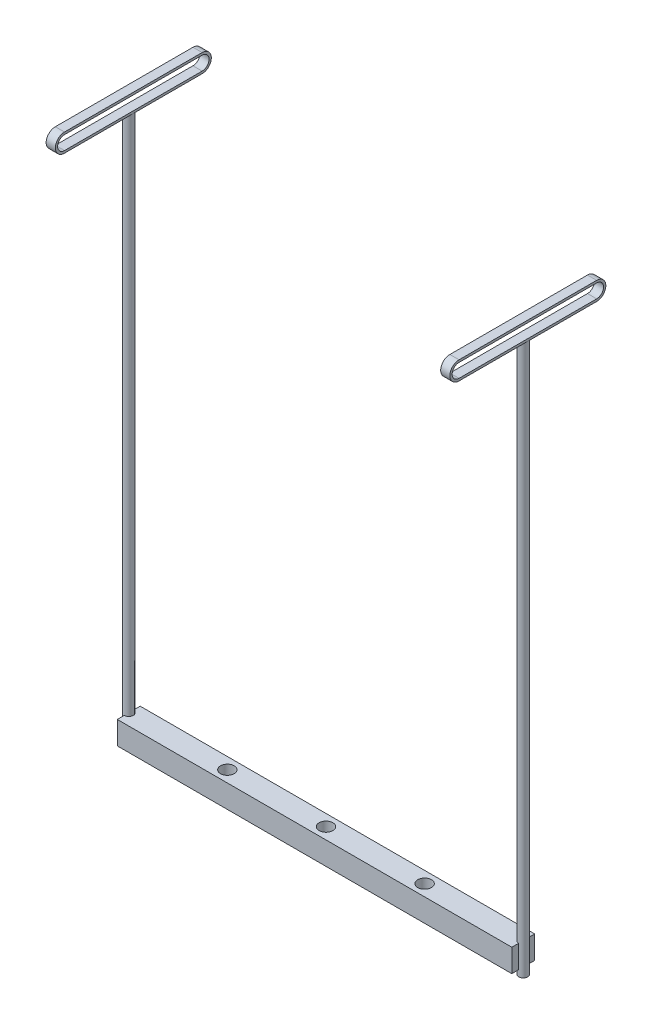
ISO-10303-21;
HEADER;
FILE_DESCRIPTION(('STEP AP214'),'2;1');
FILE_NAME('part.step','',(''),(''),'','','');
FILE_SCHEMA(('AUTOMOTIVE_DESIGN { 1 0 10303 214 1 1 1 1 }'));
ENDSEC;
DATA;
#1=APPLICATION_CONTEXT('core data for automotive mechanical design processes');
#2=APPLICATION_PROTOCOL_DEFINITION('international standard','automotive_design',2000,#1);
#3=PRODUCT_CONTEXT('',#1,'mechanical');
#4=PRODUCT('Part','Part','',(#3));
#5=PRODUCT_RELATED_PRODUCT_CATEGORY('part','',(#4));
#6=PRODUCT_DEFINITION_FORMATION('','',#4);
#7=PRODUCT_DEFINITION_CONTEXT('part definition',#1,'design');
#8=PRODUCT_DEFINITION('design','',#6,#7);
#9=PRODUCT_DEFINITION_SHAPE('','',#8);
#10=(LENGTH_UNIT() NAMED_UNIT(*) SI_UNIT(.MILLI.,.METRE.));
#11=(NAMED_UNIT(*) PLANE_ANGLE_UNIT() SI_UNIT($,.RADIAN.));
#12=(NAMED_UNIT(*) SI_UNIT($,.STERADIAN.) SOLID_ANGLE_UNIT());
#13=UNCERTAINTY_MEASURE_WITH_UNIT(LENGTH_MEASURE(1.E-05),#10,'distance_accuracy_value','');
#14=(GEOMETRIC_REPRESENTATION_CONTEXT(3) GLOBAL_UNCERTAINTY_ASSIGNED_CONTEXT((#13)) GLOBAL_UNIT_ASSIGNED_CONTEXT((#10,
#11,#12)) REPRESENTATION_CONTEXT('',''));
#15=CARTESIAN_POINT('',(0.,0.,0.));
#16=DIRECTION('',(0.,0.,1.));
#17=DIRECTION('',(1.,0.,0.));
#18=AXIS2_PLACEMENT_3D('',#15,#16,#17);
#19=CARTESIAN_POINT('',(-860.,0.,0.));
#20=DIRECTION('',(1.,0.,0.));
#21=DIRECTION('',(0.,0.,-1.));
#22=AXIS2_PLACEMENT_3D('',#19,#20,#21);
#23=PLANE('',#22);
#24=DIRECTION('',(0.,0.,-1.));
#25=VECTOR('',#24,1.);
#26=CARTESIAN_POINT('',(-860.,-1206.41380126152,24.9999999999998));
#27=LINE('',#26,#25);
#28=CARTESIAN_POINT('',(-860.,-1206.41380126152,-10.));
#29=VERTEX_POINT('',#28);
#30=CARTESIAN_POINT('',(-860.,-1206.41380126152,-25.0000000000002));
#31=VERTEX_POINT('',#30);
#32=EDGE_CURVE('E320',#29,#31,#27,.T.);
#33=ORIENTED_EDGE('',*,*,#32,.F.);
#34=DIRECTION('',(0.,1.,0.));
#35=VECTOR('',#34,1.);
#36=CARTESIAN_POINT('',(-860.,-1220.,-10.));
#37=LINE('',#36,#35);
#38=CARTESIAN_POINT('',(-860.,-1156.41380126152,-10.));
#39=VERTEX_POINT('',#38);
#40=EDGE_CURVE('E11',#29,#39,#37,.T.);
#41=ORIENTED_EDGE('',*,*,#40,.T.);
#42=DIRECTION('',(0.,0.,1.));
#43=VECTOR('',#42,1.);
#44=CARTESIAN_POINT('',(-860.,-1156.41380126152,24.9999999999998));
#45=LINE('',#44,#43);
#46=CARTESIAN_POINT('',(-860.,-1156.41380126152,-25.0000000000002));
#47=VERTEX_POINT('',#46);
#48=EDGE_CURVE('E314',#47,#39,#45,.T.);
#49=ORIENTED_EDGE('',*,*,#48,.F.);
#50=DIRECTION('',(0.,1.,0.));
#51=VECTOR('',#50,1.);
#52=CARTESIAN_POINT('',(-860.,-1156.41380126152,-25.0000000000002));
#53=LINE('',#52,#51);
#54=EDGE_CURVE('E309',#31,#47,#53,.T.);
#55=ORIENTED_EDGE('',*,*,#54,.F.);
#56=EDGE_LOOP('',(#33,#41,#49,#55));
#57=FACE_BOUND('',#56,.T.);
#58=ADVANCED_FACE('F38',(#57),#23,.F.);
#59=CARTESIAN_POINT('',(10.,-20.,-150.));
#60=DIRECTION('',(0.,1.,0.));
#61=DIRECTION('',(0.,0.,1.));
#62=AXIS2_PLACEMENT_3D('',#59,#60,#61);
#63=PLANE('',#62);
#64=CARTESIAN_POINT('',(0.,-20.,0.));
#65=DIRECTION('',(0.,1.,0.));
#66=DIRECTION('',(0.,0.,1.));
#67=AXIS2_PLACEMENT_3D('',#64,#65,#66);
#68=CIRCLE('',#67,10.);
#69=CARTESIAN_POINT('',(-10.,-20.,0.));
#70=VERTEX_POINT('',#69);
#71=CARTESIAN_POINT('',(10.,-20.,0.));
#72=VERTEX_POINT('',#71);
#73=EDGE_CURVE('E415',#70,#72,#68,.F.);
#74=ORIENTED_EDGE('',*,*,#73,.F.);
#75=DIRECTION('',(0.,0.,-1.));
#76=VECTOR('',#75,1.);
#77=CARTESIAN_POINT('',(-10.,-20.,-150.));
#78=LINE('',#77,#76);
#79=CARTESIAN_POINT('',(-10.,-20.,-150.));
#80=VERTEX_POINT('',#79);
#81=EDGE_CURVE('E398',#70,#80,#78,.T.);
#82=ORIENTED_EDGE('',*,*,#81,.T.);
#83=DIRECTION('',(-1.,0.,0.));
#84=VECTOR('',#83,1.);
#85=CARTESIAN_POINT('',(10.,-20.,-150.));
#86=LINE('',#85,#84);
#87=CARTESIAN_POINT('',(10.,-20.,-150.));
#88=VERTEX_POINT('',#87);
#89=EDGE_CURVE('E409',#88,#80,#86,.T.);
#90=ORIENTED_EDGE('',*,*,#89,.F.);
#91=DIRECTION('',(0.,0.,-1.));
#92=VECTOR('',#91,1.);
#93=CARTESIAN_POINT('',(10.,-20.,-150.));
#94=LINE('',#93,#92);
#95=EDGE_CURVE('E386',#72,#88,#94,.T.);
#96=ORIENTED_EDGE('',*,*,#95,.F.);
#97=EDGE_LOOP('',(#74,#82,#90,#96));
#98=FACE_BOUND('',#97,.T.);
#99=ADVANCED_FACE('F483',(#98),#63,.F.);
#100=CARTESIAN_POINT('',(10.,0.,150.));
#101=DIRECTION('',(1.,0.,0.));
#102=DIRECTION('',(0.,0.,-1.));
#103=AXIS2_PLACEMENT_3D('',#100,#101,#102);
#104=PLANE('',#103);
#105=CARTESIAN_POINT('',(10.,0.,150.));
#106=DIRECTION('',(1.,0.,0.));
#107=DIRECTION('',(0.,0.,-1.));
#108=AXIS2_PLACEMENT_3D('',#105,#106,#107);
#109=CIRCLE('',#108,20.);
#110=CARTESIAN_POINT('',(10.,20.,150.));
#111=VERTEX_POINT('',#110);
#112=CARTESIAN_POINT('',(10.,-20.,150.));
#113=VERTEX_POINT('',#112);
#114=EDGE_CURVE('E383',#111,#113,#109,.T.);
#115=ORIENTED_EDGE('',*,*,#114,.T.);
#116=EDGE_CURVE('E388',#113,#72,#94,.T.);
#117=ORIENTED_EDGE('',*,*,#116,.T.);
#118=ORIENTED_EDGE('',*,*,#95,.T.);
#119=CARTESIAN_POINT('',(10.,0.,-150.));
#120=DIRECTION('',(1.,0.,0.));
#121=DIRECTION('',(0.,0.,1.));
#122=AXIS2_PLACEMENT_3D('',#119,#120,#121);
#123=CIRCLE('',#122,20.);
#124=CARTESIAN_POINT('',(10.,20.,-150.));
#125=VERTEX_POINT('',#124);
#126=EDGE_CURVE('E391',#88,#125,#123,.T.);
#127=ORIENTED_EDGE('',*,*,#126,.T.);
#128=DIRECTION('',(0.,0.,1.));
#129=VECTOR('',#128,1.);
#130=CARTESIAN_POINT('',(10.,20.,150.));
#131=LINE('',#130,#129);
#132=EDGE_CURVE('E393',#125,#111,#131,.T.);
#133=ORIENTED_EDGE('',*,*,#132,.T.);
#134=EDGE_LOOP('',(#115,#117,#118,#127,#133));
#135=FACE_BOUND('',#134,.T.);
#136=DIRECTION('',(0.,0.,1.));
#137=VECTOR('',#136,1.);
#138=CARTESIAN_POINT('',(10.,15.,150.));
#139=LINE('',#138,#137);
#140=CARTESIAN_POINT('',(10.,15.,-150.));
#141=VERTEX_POINT('',#140);
#142=CARTESIAN_POINT('',(10.,15.,150.));
#143=VERTEX_POINT('',#142);
#144=EDGE_CURVE('E354',#141,#143,#139,.T.);
#145=ORIENTED_EDGE('',*,*,#144,.F.);
#146=CARTESIAN_POINT('',(10.,0.,-150.));
#147=DIRECTION('',(1.,0.,0.));
#148=DIRECTION('',(0.,0.,1.));
#149=AXIS2_PLACEMENT_3D('',#146,#147,#148);
#150=CIRCLE('',#149,15.);
#151=CARTESIAN_POINT('',(10.,-15.,-150.));
#152=VERTEX_POINT('',#151);
#153=EDGE_CURVE('E352',#152,#141,#150,.T.);
#154=ORIENTED_EDGE('',*,*,#153,.F.);
#155=DIRECTION('',(0.,0.,-1.));
#156=VECTOR('',#155,1.);
#157=CARTESIAN_POINT('',(10.,-15.,-150.));
#158=LINE('',#157,#156);
#159=CARTESIAN_POINT('',(10.,-15.,150.));
#160=VERTEX_POINT('',#159);
#161=EDGE_CURVE('E360',#160,#152,#158,.T.);
#162=ORIENTED_EDGE('',*,*,#161,.F.);
#163=CARTESIAN_POINT('',(10.,0.,150.));
#164=DIRECTION('',(1.,0.,0.));
#165=DIRECTION('',(0.,0.,-1.));
#166=AXIS2_PLACEMENT_3D('',#163,#164,#165);
#167=CIRCLE('',#166,15.);
#168=EDGE_CURVE('E357',#143,#160,#167,.T.);
#169=ORIENTED_EDGE('',*,*,#168,.F.);
#170=EDGE_LOOP('',(#145,#154,#162,#169));
#171=FACE_BOUND('',#170,.T.);
#172=ADVANCED_FACE('F487',(#135,#171),#104,.T.);
#173=CARTESIAN_POINT('',(-10.,0.,150.));
#174=DIRECTION('',(1.,0.,0.));
#175=DIRECTION('',(0.,0.,-1.));
#176=AXIS2_PLACEMENT_3D('',#173,#174,#175);
#177=PLANE('',#176);
#178=CARTESIAN_POINT('',(-10.,0.,150.));
#179=DIRECTION('',(1.,0.,0.));
#180=DIRECTION('',(0.,0.,-1.));
#181=AXIS2_PLACEMENT_3D('',#178,#179,#180);
#182=CIRCLE('',#181,20.);
#183=CARTESIAN_POINT('',(-10.,20.,150.));
#184=VERTEX_POINT('',#183);
#185=CARTESIAN_POINT('',(-10.,-20.,150.));
#186=VERTEX_POINT('',#185);
#187=EDGE_CURVE('E382',#184,#186,#182,.T.);
#188=ORIENTED_EDGE('',*,*,#187,.F.);
#189=DIRECTION('',(0.,0.,1.));
#190=VECTOR('',#189,1.);
#191=CARTESIAN_POINT('',(-10.,20.,150.));
#192=LINE('',#191,#190);
#193=CARTESIAN_POINT('',(-10.,20.,-150.));
#194=VERTEX_POINT('',#193);
#195=EDGE_CURVE('E387',#194,#184,#192,.T.);
#196=ORIENTED_EDGE('',*,*,#195,.F.);
#197=CARTESIAN_POINT('',(-10.,0.,-150.));
#198=DIRECTION('',(1.,0.,0.));
#199=DIRECTION('',(0.,0.,1.));
#200=AXIS2_PLACEMENT_3D('',#197,#198,#199);
#201=CIRCLE('',#200,20.);
#202=EDGE_CURVE('E401',#80,#194,#201,.T.);
#203=ORIENTED_EDGE('',*,*,#202,.F.);
#204=ORIENTED_EDGE('',*,*,#81,.F.);
#205=EDGE_CURVE('E399',#186,#70,#78,.T.);
#206=ORIENTED_EDGE('',*,*,#205,.F.);
#207=EDGE_LOOP('',(#188,#196,#203,#204,#206));
#208=FACE_BOUND('',#207,.T.);
#209=CARTESIAN_POINT('',(-10.,0.,-150.));
#210=DIRECTION('',(1.,0.,0.));
#211=DIRECTION('',(0.,0.,1.));
#212=AXIS2_PLACEMENT_3D('',#209,#210,#211);
#213=CIRCLE('',#212,15.);
#214=CARTESIAN_POINT('',(-10.,-15.,-150.));
#215=VERTEX_POINT('',#214);
#216=CARTESIAN_POINT('',(-10.,15.,-150.));
#217=VERTEX_POINT('',#216);
#218=EDGE_CURVE('E349',#215,#217,#213,.T.);
#219=ORIENTED_EDGE('',*,*,#218,.T.);
#220=DIRECTION('',(0.,0.,1.));
#221=VECTOR('',#220,1.);
#222=CARTESIAN_POINT('',(-10.,15.,150.));
#223=LINE('',#222,#221);
#224=CARTESIAN_POINT('',(-10.,15.,150.));
#225=VERTEX_POINT('',#224);
#226=EDGE_CURVE('E365',#217,#225,#223,.T.);
#227=ORIENTED_EDGE('',*,*,#226,.T.);
#228=CARTESIAN_POINT('',(-10.,0.,150.));
#229=DIRECTION('',(1.,0.,0.));
#230=DIRECTION('',(0.,0.,-1.));
#231=AXIS2_PLACEMENT_3D('',#228,#229,#230);
#232=CIRCLE('',#231,15.);
#233=CARTESIAN_POINT('',(-10.,-15.,150.));
#234=VERTEX_POINT('',#233);
#235=EDGE_CURVE('E368',#225,#234,#232,.T.);
#236=ORIENTED_EDGE('',*,*,#235,.T.);
#237=DIRECTION('',(0.,0.,-1.));
#238=VECTOR('',#237,1.);
#239=CARTESIAN_POINT('',(-10.,-15.,-150.));
#240=LINE('',#239,#238);
#241=EDGE_CURVE('E355',#234,#215,#240,.T.);
#242=ORIENTED_EDGE('',*,*,#241,.T.);
#243=EDGE_LOOP('',(#219,#227,#236,#242));
#244=FACE_BOUND('',#243,.T.);
#245=ADVANCED_FACE('F529',(#208,#244),#177,.F.);
#246=CARTESIAN_POINT('',(10.,0.,150.));
#247=DIRECTION('',(-1.,0.,0.));
#248=DIRECTION('',(0.,0.,1.));
#249=AXIS2_PLACEMENT_3D('',#246,#247,#248);
#250=CYLINDRICAL_SURFACE('',#249,20.);
#251=ORIENTED_EDGE('',*,*,#187,.T.);
#252=DIRECTION('',(-1.,0.,0.));
#253=VECTOR('',#252,1.);
#254=CARTESIAN_POINT('',(10.,-20.,150.));
#255=LINE('',#254,#253);
#256=EDGE_CURVE('E412',#113,#186,#255,.T.);
#257=ORIENTED_EDGE('',*,*,#256,.F.);
#258=ORIENTED_EDGE('',*,*,#114,.F.);
#259=DIRECTION('',(-1.,0.,0.));
#260=VECTOR('',#259,1.);
#261=CARTESIAN_POINT('',(10.,20.,150.));
#262=LINE('',#261,#260);
#263=EDGE_CURVE('E395',#111,#184,#262,.T.);
#264=ORIENTED_EDGE('',*,*,#263,.T.);
#265=EDGE_LOOP('',(#251,#257,#258,#264));
#266=FACE_BOUND('',#265,.T.);
#267=ADVANCED_FACE('F40',(#266),#250,.T.);
#268=CARTESIAN_POINT('',(0.,-20.,0.));
#269=DIRECTION('',(0.,-1.,0.));
#270=DIRECTION('',(0.,0.,-1.));
#271=AXIS2_PLACEMENT_3D('',#268,#269,#270);
#272=CIRCLE('',#271,10.);
#273=EDGE_CURVE('E339',#72,#70,#272,.T.);
#274=ORIENTED_EDGE('',*,*,#273,.F.);
#275=ORIENTED_EDGE('',*,*,#116,.F.);
#276=ORIENTED_EDGE('',*,*,#256,.T.);
#277=ORIENTED_EDGE('',*,*,#205,.T.);
#278=EDGE_LOOP('',(#274,#275,#276,#277));
#279=FACE_BOUND('',#278,.T.);
#280=ADVANCED_FACE('F489',(#279),#63,.F.);
#281=CARTESIAN_POINT('',(10.,0.,-150.));
#282=DIRECTION('',(-1.,0.,0.));
#283=DIRECTION('',(0.,0.,1.));
#284=AXIS2_PLACEMENT_3D('',#281,#282,#283);
#285=CYLINDRICAL_SURFACE('',#284,20.);
#286=ORIENTED_EDGE('',*,*,#202,.T.);
#287=DIRECTION('',(-1.,0.,0.));
#288=VECTOR('',#287,1.);
#289=CARTESIAN_POINT('',(10.,20.,-150.));
#290=LINE('',#289,#288);
#291=EDGE_CURVE('E406',#125,#194,#290,.T.);
#292=ORIENTED_EDGE('',*,*,#291,.F.);
#293=ORIENTED_EDGE('',*,*,#126,.F.);
#294=ORIENTED_EDGE('',*,*,#89,.T.);
#295=EDGE_LOOP('',(#286,#292,#293,#294));
#296=FACE_BOUND('',#295,.T.);
#297=ADVANCED_FACE('F536',(#296),#285,.T.);
#298=CARTESIAN_POINT('',(10.,20.,150.));
#299=DIRECTION('',(0.,-1.,0.));
#300=DIRECTION('',(0.,0.,-1.));
#301=AXIS2_PLACEMENT_3D('',#298,#299,#300);
#302=PLANE('',#301);
#303=ORIENTED_EDGE('',*,*,#195,.T.);
#304=ORIENTED_EDGE('',*,*,#263,.F.);
#305=ORIENTED_EDGE('',*,*,#132,.F.);
#306=ORIENTED_EDGE('',*,*,#291,.T.);
#307=EDGE_LOOP('',(#303,#304,#305,#306));
#308=FACE_BOUND('',#307,.T.);
#309=ADVANCED_FACE('F525',(#308),#302,.F.);
#310=CARTESIAN_POINT('',(10.,0.,-150.));
#311=DIRECTION('',(-1.,0.,0.));
#312=DIRECTION('',(0.,0.,1.));
#313=AXIS2_PLACEMENT_3D('',#310,#311,#312);
#314=CYLINDRICAL_SURFACE('',#313,15.);
#315=ORIENTED_EDGE('',*,*,#218,.F.);
#316=DIRECTION('',(-1.,0.,0.));
#317=VECTOR('',#316,1.);
#318=CARTESIAN_POINT('',(10.,-15.,-150.));
#319=LINE('',#318,#317);
#320=EDGE_CURVE('E362',#152,#215,#319,.T.);
#321=ORIENTED_EDGE('',*,*,#320,.F.);
#322=ORIENTED_EDGE('',*,*,#153,.T.);
#323=DIRECTION('',(-1.,0.,0.));
#324=VECTOR('',#323,1.);
#325=CARTESIAN_POINT('',(10.,15.,-150.));
#326=LINE('',#325,#324);
#327=EDGE_CURVE('E379',#141,#217,#326,.T.);
#328=ORIENTED_EDGE('',*,*,#327,.T.);
#329=EDGE_LOOP('',(#315,#321,#322,#328));
#330=FACE_BOUND('',#329,.T.);
#331=ADVANCED_FACE('F521',(#330),#314,.F.);
#332=CARTESIAN_POINT('',(10.,15.,150.));
#333=DIRECTION('',(0.,-1.,0.));
#334=DIRECTION('',(0.,0.,-1.));
#335=AXIS2_PLACEMENT_3D('',#332,#333,#334);
#336=PLANE('',#335);
#337=ORIENTED_EDGE('',*,*,#226,.F.);
#338=ORIENTED_EDGE('',*,*,#327,.F.);
#339=ORIENTED_EDGE('',*,*,#144,.T.);
#340=DIRECTION('',(-1.,0.,0.));
#341=VECTOR('',#340,1.);
#342=CARTESIAN_POINT('',(10.,15.,150.));
#343=LINE('',#342,#341);
#344=EDGE_CURVE('E377',#143,#225,#343,.T.);
#345=ORIENTED_EDGE('',*,*,#344,.T.);
#346=EDGE_LOOP('',(#337,#338,#339,#345));
#347=FACE_BOUND('',#346,.T.);
#348=ADVANCED_FACE('F517',(#347),#336,.T.);
#349=CARTESIAN_POINT('',(10.,0.,150.));
#350=DIRECTION('',(-1.,0.,0.));
#351=DIRECTION('',(0.,0.,1.));
#352=AXIS2_PLACEMENT_3D('',#349,#350,#351);
#353=CYLINDRICAL_SURFACE('',#352,15.);
#354=ORIENTED_EDGE('',*,*,#235,.F.);
#355=ORIENTED_EDGE('',*,*,#344,.F.);
#356=ORIENTED_EDGE('',*,*,#168,.T.);
#357=DIRECTION('',(-1.,0.,0.));
#358=VECTOR('',#357,1.);
#359=CARTESIAN_POINT('',(10.,-15.,150.));
#360=LINE('',#359,#358);
#361=EDGE_CURVE('E375',#160,#234,#360,.T.);
#362=ORIENTED_EDGE('',*,*,#361,.T.);
#363=EDGE_LOOP('',(#354,#355,#356,#362));
#364=FACE_BOUND('',#363,.T.);
#365=ADVANCED_FACE('F513',(#364),#353,.F.);
#366=CARTESIAN_POINT('',(10.,-15.,-150.));
#367=DIRECTION('',(0.,1.,0.));
#368=DIRECTION('',(0.,0.,1.));
#369=AXIS2_PLACEMENT_3D('',#366,#367,#368);
#370=PLANE('',#369);
#371=ORIENTED_EDGE('',*,*,#241,.F.);
#372=ORIENTED_EDGE('',*,*,#361,.F.);
#373=ORIENTED_EDGE('',*,*,#161,.T.);
#374=ORIENTED_EDGE('',*,*,#320,.T.);
#375=EDGE_LOOP('',(#371,#372,#373,#374));
#376=FACE_BOUND('',#375,.T.);
#377=ADVANCED_FACE('F510',(#376),#370,.T.);
#378=CARTESIAN_POINT('',(0.,-1220.,0.));
#379=DIRECTION('',(0.,1.,0.));
#380=DIRECTION('',(0.,0.,1.));
#381=AXIS2_PLACEMENT_3D('',#378,#379,#380);
#382=CYLINDRICAL_SURFACE('',#381,10.);
#383=CARTESIAN_POINT('',(0.,-1206.41380126152,0.));
#384=DIRECTION('',(0.,-1.,0.));
#385=DIRECTION('',(0.,0.,-1.));
#386=AXIS2_PLACEMENT_3D('',#383,#384,#385);
#387=CIRCLE('',#386,10.);
#388=CARTESIAN_POINT('',(0.,-1206.41380126152,9.99999999999999));
#389=VERTEX_POINT('',#388);
#390=CARTESIAN_POINT('',(0.,-1206.41380126152,-10.));
#391=VERTEX_POINT('',#390);
#392=EDGE_CURVE('E424',#389,#391,#387,.T.);
#393=ORIENTED_EDGE('',*,*,#392,.T.);
#394=DIRECTION('',(0.,1.,0.));
#395=VECTOR('',#394,1.);
#396=CARTESIAN_POINT('',(0.,-1220.,-10.));
#397=LINE('',#396,#395);
#398=CARTESIAN_POINT('',(0.,-1156.41380126152,-10.));
#399=VERTEX_POINT('',#398);
#400=EDGE_CURVE('E427',#391,#399,#397,.T.);
#401=ORIENTED_EDGE('',*,*,#400,.T.);
#402=CARTESIAN_POINT('',(0.,-1156.41380126152,0.));
#403=DIRECTION('',(0.,1.,0.));
#404=DIRECTION('',(0.,0.,1.));
#405=AXIS2_PLACEMENT_3D('',#402,#403,#404);
#406=CIRCLE('',#405,10.);
#407=CARTESIAN_POINT('',(0.,-1156.41380126152,9.99999999999999));
#408=VERTEX_POINT('',#407);
#409=EDGE_CURVE('E421',#399,#408,#406,.T.);
#410=ORIENTED_EDGE('',*,*,#409,.T.);
#411=DIRECTION('',(0.,1.,0.));
#412=VECTOR('',#411,1.);
#413=CARTESIAN_POINT('',(0.,-1220.,9.99999999999999));
#414=LINE('',#413,#412);
#415=EDGE_CURVE('E418',#408,#389,#414,.F.);
#416=ORIENTED_EDGE('',*,*,#415,.T.);
#417=EDGE_LOOP('',(#393,#401,#410,#416));
#418=FACE_BOUND('',#417,.T.);
#419=CARTESIAN_POINT('',(0.,-1220.,0.));
#420=DIRECTION('',(0.,-1.,0.));
#421=DIRECTION('',(0.,0.,-1.));
#422=AXIS2_PLACEMENT_3D('',#419,#420,#421);
#423=CIRCLE('',#422,10.);
#424=CARTESIAN_POINT('',(0.,-1220.,-10.));
#425=VERTEX_POINT('',#424);
#426=EDGE_CURVE('E346',#425,#425,#423,.T.);
#427=ORIENTED_EDGE('',*,*,#426,.F.);
#428=EDGE_LOOP('',(#427));
#429=FACE_BOUND('',#428,.T.);
#430=ORIENTED_EDGE('',*,*,#273,.T.);
#431=ORIENTED_EDGE('',*,*,#73,.T.);
#432=EDGE_LOOP('',(#430,#431));
#433=FACE_BOUND('',#432,.T.);
#434=ADVANCED_FACE('F468',(#418,#429,#433),#382,.T.);
#435=CARTESIAN_POINT('',(0.,-1220.,0.));
#436=DIRECTION('',(0.,-1.,0.));
#437=DIRECTION('',(0.,0.,-1.));
#438=AXIS2_PLACEMENT_3D('',#435,#436,#437);
#439=PLANE('',#438);
#440=ORIENTED_EDGE('',*,*,#426,.T.);
#441=EDGE_LOOP('',(#440));
#442=FACE_BOUND('',#441,.T.);
#443=ADVANCED_FACE('F479',(#442),#439,.T.);
#444=CARTESIAN_POINT('',(0.,0.,0.));
#445=DIRECTION('',(1.,0.,0.));
#446=DIRECTION('',(0.,0.,-1.));
#447=AXIS2_PLACEMENT_3D('',#444,#445,#446);
#448=PLANE('',#447);
#449=ORIENTED_EDGE('',*,*,#400,.F.);
#450=DIRECTION('',(0.,0.,-1.));
#451=VECTOR('',#450,1.);
#452=CARTESIAN_POINT('',(0.,-1206.41380126152,24.9999999999998));
#453=LINE('',#452,#451);
#454=CARTESIAN_POINT('',(0.,-1206.41380126152,-25.0000000000002));
#455=VERTEX_POINT('',#454);
#456=EDGE_CURVE('E334',#391,#455,#453,.T.);
#457=ORIENTED_EDGE('',*,*,#456,.T.);
#458=DIRECTION('',(0.,1.,0.));
#459=VECTOR('',#458,1.);
#460=CARTESIAN_POINT('',(0.,-1156.41380126152,-25.0000000000002));
#461=LINE('',#460,#459);
#462=CARTESIAN_POINT('',(0.,-1156.41380126152,-25.0000000000002));
#463=VERTEX_POINT('',#462);
#464=EDGE_CURVE('E308',#455,#463,#461,.T.);
#465=ORIENTED_EDGE('',*,*,#464,.T.);
#466=DIRECTION('',(0.,0.,1.));
#467=VECTOR('',#466,1.);
#468=CARTESIAN_POINT('',(0.,-1156.41380126152,24.9999999999998));
#469=LINE('',#468,#467);
#470=EDGE_CURVE('E328',#463,#399,#469,.T.);
#471=ORIENTED_EDGE('',*,*,#470,.T.);
#472=EDGE_LOOP('',(#449,#457,#465,#471));
#473=FACE_BOUND('',#472,.T.);
#474=ADVANCED_FACE('F466',(#473),#448,.T.);
#475=ORIENTED_EDGE('',*,*,#415,.F.);
#476=CARTESIAN_POINT('',(0.,-1156.41380126152,24.9999999999998));
#477=VERTEX_POINT('',#476);
#478=EDGE_CURVE('E327',#408,#477,#469,.T.);
#479=ORIENTED_EDGE('',*,*,#478,.T.);
#480=DIRECTION('',(0.,-1.,0.));
#481=VECTOR('',#480,1.);
#482=CARTESIAN_POINT('',(0.,-1156.41380126152,24.9999999999998));
#483=LINE('',#482,#481);
#484=CARTESIAN_POINT('',(0.,-1206.41380126152,24.9999999999998));
#485=VERTEX_POINT('',#484);
#486=EDGE_CURVE('E331',#477,#485,#483,.T.);
#487=ORIENTED_EDGE('',*,*,#486,.T.);
#488=EDGE_CURVE('E313',#485,#389,#453,.T.);
#489=ORIENTED_EDGE('',*,*,#488,.T.);
#490=EDGE_LOOP('',(#475,#479,#487,#489));
#491=FACE_BOUND('',#490,.T.);
#492=ADVANCED_FACE('F471',(#491),#448,.T.);
#493=CARTESIAN_POINT('',(-860.,-1156.41380126152,-25.0000000000002));
#494=DIRECTION('',(0.,0.,-1.));
#495=DIRECTION('',(0.,1.,0.));
#496=AXIS2_PLACEMENT_3D('',#493,#494,#495);
#497=PLANE('',#496);
#498=ORIENTED_EDGE('',*,*,#464,.F.);
#499=DIRECTION('',(1.,0.,0.));
#500=VECTOR('',#499,1.);
#501=CARTESIAN_POINT('',(-860.,-1206.41380126152,-25.0000000000002));
#502=LINE('',#501,#500);
#503=EDGE_CURVE('E336',#31,#455,#502,.T.);
#504=ORIENTED_EDGE('',*,*,#503,.F.);
#505=ORIENTED_EDGE('',*,*,#54,.T.);
#506=DIRECTION('',(1.,0.,0.));
#507=VECTOR('',#506,1.);
#508=CARTESIAN_POINT('',(-860.,-1156.41380126152,-25.0000000000002));
#509=LINE('',#508,#507);
#510=EDGE_CURVE('E324',#47,#463,#509,.T.);
#511=ORIENTED_EDGE('',*,*,#510,.T.);
#512=EDGE_LOOP('',(#498,#504,#505,#511));
#513=FACE_BOUND('',#512,.T.);
#514=ADVANCED_FACE('F463',(#513),#497,.T.);
#515=CARTESIAN_POINT('',(-860.,-1206.41380126152,24.9999999999998));
#516=DIRECTION('',(0.,-1.,0.));
#517=DIRECTION('',(0.,0.,-1.));
#518=AXIS2_PLACEMENT_3D('',#515,#516,#517);
#519=PLANE('',#518);
#520=CARTESIAN_POINT('',(-860.,-1206.41380126152,0.));
#521=DIRECTION('',(0.,-1.,0.));
#522=DIRECTION('',(0.,0.,-1.));
#523=AXIS2_PLACEMENT_3D('',#520,#521,#522);
#524=CIRCLE('',#523,10.);
#525=CARTESIAN_POINT('',(-860.,-1206.41380126152,9.99999999999999));
#526=VERTEX_POINT('',#525);
#527=EDGE_CURVE('E60',#29,#526,#524,.T.);
#528=ORIENTED_EDGE('',*,*,#527,.F.);
#529=ORIENTED_EDGE('',*,*,#32,.T.);
#530=ORIENTED_EDGE('',*,*,#503,.T.);
#531=ORIENTED_EDGE('',*,*,#456,.F.);
#532=ORIENTED_EDGE('',*,*,#392,.F.);
#533=ORIENTED_EDGE('',*,*,#488,.F.);
#534=DIRECTION('',(1.,0.,0.));
#535=VECTOR('',#534,1.);
#536=CARTESIAN_POINT('',(-860.,-1206.41380126152,24.9999999999998));
#537=LINE('',#536,#535);
#538=CARTESIAN_POINT('',(-860.,-1206.41380126152,24.9999999999998));
#539=VERTEX_POINT('',#538);
#540=EDGE_CURVE('E340',#539,#485,#537,.T.);
#541=ORIENTED_EDGE('',*,*,#540,.F.);
#542=EDGE_CURVE('E321',#539,#526,#27,.T.);
#543=ORIENTED_EDGE('',*,*,#542,.T.);
#544=EDGE_LOOP('',(#528,#529,#530,#531,#532,#533,#541,#543));
#545=FACE_BOUND('',#544,.T.);
#546=CARTESIAN_POINT('',(-645.,-1206.41380126152,0.));
#547=DIRECTION('',(0.,-1.,0.));
#548=DIRECTION('',(0.,0.,-1.));
#549=AXIS2_PLACEMENT_3D('',#546,#547,#548);
#550=CIRCLE('',#549,15.);
#551=CARTESIAN_POINT('',(-645.,-1206.41380126152,-15.));
#552=VERTEX_POINT('',#551);
#553=EDGE_CURVE('E305',#552,#552,#550,.T.);
#554=ORIENTED_EDGE('',*,*,#553,.F.);
#555=EDGE_LOOP('',(#554));
#556=FACE_BOUND('',#555,.T.);
#557=CARTESIAN_POINT('',(-430.,-1206.41380126152,0.));
#558=DIRECTION('',(0.,-1.,0.));
#559=DIRECTION('',(0.,0.,-1.));
#560=AXIS2_PLACEMENT_3D('',#557,#558,#559);
#561=CIRCLE('',#560,15.);
#562=CARTESIAN_POINT('',(-430.,-1206.41380126152,-15.));
#563=VERTEX_POINT('',#562);
#564=EDGE_CURVE('E301',#563,#563,#561,.T.);
#565=ORIENTED_EDGE('',*,*,#564,.F.);
#566=EDGE_LOOP('',(#565));
#567=FACE_BOUND('',#566,.T.);
#568=CARTESIAN_POINT('',(-215.,-1206.41380126152,0.));
#569=DIRECTION('',(0.,-1.,0.));
#570=DIRECTION('',(0.,0.,-1.));
#571=AXIS2_PLACEMENT_3D('',#568,#569,#570);
#572=CIRCLE('',#571,15.);
#573=CARTESIAN_POINT('',(-215.,-1206.41380126152,-15.));
#574=VERTEX_POINT('',#573);
#575=EDGE_CURVE('E297',#574,#574,#572,.T.);
#576=ORIENTED_EDGE('',*,*,#575,.F.);
#577=EDGE_LOOP('',(#576));
#578=FACE_BOUND('',#577,.T.);
#579=ADVANCED_FACE('F442',(#545,#556,#567,#578),#519,.T.);
#580=CARTESIAN_POINT('',(-860.,-1156.41380126152,24.9999999999998));
#581=DIRECTION('',(0.,0.,1.));
#582=DIRECTION('',(0.,-1.,0.));
#583=AXIS2_PLACEMENT_3D('',#580,#581,#582);
#584=PLANE('',#583);
#585=ORIENTED_EDGE('',*,*,#486,.F.);
#586=DIRECTION('',(1.,0.,0.));
#587=VECTOR('',#586,1.);
#588=CARTESIAN_POINT('',(-860.,-1156.41380126152,24.9999999999998));
#589=LINE('',#588,#587);
#590=CARTESIAN_POINT('',(-860.,-1156.41380126152,24.9999999999998));
#591=VERTEX_POINT('',#590);
#592=EDGE_CURVE('E342',#591,#477,#589,.T.);
#593=ORIENTED_EDGE('',*,*,#592,.F.);
#594=DIRECTION('',(0.,-1.,0.));
#595=VECTOR('',#594,1.);
#596=CARTESIAN_POINT('',(-860.,-1156.41380126152,24.9999999999998));
#597=LINE('',#596,#595);
#598=EDGE_CURVE('E317',#591,#539,#597,.T.);
#599=ORIENTED_EDGE('',*,*,#598,.T.);
#600=ORIENTED_EDGE('',*,*,#540,.T.);
#601=EDGE_LOOP('',(#585,#593,#599,#600));
#602=FACE_BOUND('',#601,.T.);
#603=ADVANCED_FACE('F450',(#602),#584,.T.);
#604=CARTESIAN_POINT('',(-860.,-1156.41380126152,24.9999999999998));
#605=DIRECTION('',(0.,1.,0.));
#606=DIRECTION('',(0.,0.,1.));
#607=AXIS2_PLACEMENT_3D('',#604,#605,#606);
#608=PLANE('',#607);
#609=CARTESIAN_POINT('',(-860.,-1156.41380126152,0.));
#610=DIRECTION('',(0.,1.,0.));
#611=DIRECTION('',(0.,0.,1.));
#612=AXIS2_PLACEMENT_3D('',#609,#610,#611);
#613=CIRCLE('',#612,10.);
#614=CARTESIAN_POINT('',(-860.,-1156.41380126152,9.99999999999999));
#615=VERTEX_POINT('',#614);
#616=EDGE_CURVE('E291',#615,#39,#613,.T.);
#617=ORIENTED_EDGE('',*,*,#616,.F.);
#618=EDGE_CURVE('E312',#615,#591,#45,.T.);
#619=ORIENTED_EDGE('',*,*,#618,.T.);
#620=ORIENTED_EDGE('',*,*,#592,.T.);
#621=ORIENTED_EDGE('',*,*,#478,.F.);
#622=ORIENTED_EDGE('',*,*,#409,.F.);
#623=ORIENTED_EDGE('',*,*,#470,.F.);
#624=ORIENTED_EDGE('',*,*,#510,.F.);
#625=ORIENTED_EDGE('',*,*,#48,.T.);
#626=EDGE_LOOP('',(#617,#619,#620,#621,#622,#623,#624,#625));
#627=FACE_BOUND('',#626,.T.);
#628=CARTESIAN_POINT('',(-645.,-1156.41380126152,0.));
#629=DIRECTION('',(0.,1.,0.));
#630=DIRECTION('',(0.,0.,1.));
#631=AXIS2_PLACEMENT_3D('',#628,#629,#630);
#632=CIRCLE('',#631,15.);
#633=CARTESIAN_POINT('',(-645.,-1156.41380126152,15.));
#634=VERTEX_POINT('',#633);
#635=EDGE_CURVE('E304',#634,#634,#632,.T.);
#636=ORIENTED_EDGE('',*,*,#635,.F.);
#637=EDGE_LOOP('',(#636));
#638=FACE_BOUND('',#637,.T.);
#639=CARTESIAN_POINT('',(-430.,-1156.41380126152,0.));
#640=DIRECTION('',(0.,1.,0.));
#641=DIRECTION('',(0.,0.,1.));
#642=AXIS2_PLACEMENT_3D('',#639,#640,#641);
#643=CIRCLE('',#642,15.);
#644=CARTESIAN_POINT('',(-430.,-1156.41380126152,15.));
#645=VERTEX_POINT('',#644);
#646=EDGE_CURVE('E300',#645,#645,#643,.T.);
#647=ORIENTED_EDGE('',*,*,#646,.F.);
#648=EDGE_LOOP('',(#647));
#649=FACE_BOUND('',#648,.T.);
#650=CARTESIAN_POINT('',(-215.,-1156.41380126152,0.));
#651=DIRECTION('',(0.,1.,0.));
#652=DIRECTION('',(0.,0.,1.));
#653=AXIS2_PLACEMENT_3D('',#650,#651,#652);
#654=CIRCLE('',#653,15.);
#655=CARTESIAN_POINT('',(-215.,-1156.41380126152,15.));
#656=VERTEX_POINT('',#655);
#657=EDGE_CURVE('E296',#656,#656,#654,.T.);
#658=ORIENTED_EDGE('',*,*,#657,.F.);
#659=EDGE_LOOP('',(#658));
#660=FACE_BOUND('',#659,.T.);
#661=ADVANCED_FACE('F453',(#627,#638,#649,#660),#608,.T.);
#662=ORIENTED_EDGE('',*,*,#618,.F.);
#663=DIRECTION('',(0.,1.,0.));
#664=VECTOR('',#663,1.);
#665=CARTESIAN_POINT('',(-860.,-1220.,9.99999999999999));
#666=LINE('',#665,#664);
#667=EDGE_CURVE('E46',#615,#526,#666,.F.);
#668=ORIENTED_EDGE('',*,*,#667,.T.);
#669=ORIENTED_EDGE('',*,*,#542,.F.);
#670=ORIENTED_EDGE('',*,*,#598,.F.);
#671=EDGE_LOOP('',(#662,#668,#669,#670));
#672=FACE_BOUND('',#671,.T.);
#673=ADVANCED_FACE('F438',(#672),#23,.F.);
#674=CARTESIAN_POINT('',(-215.,-1220.,0.));
#675=DIRECTION('',(0.,1.,0.));
#676=DIRECTION('',(0.,0.,1.));
#677=AXIS2_PLACEMENT_3D('',#674,#675,#676);
#678=CYLINDRICAL_SURFACE('',#677,15.);
#679=ORIENTED_EDGE('',*,*,#575,.T.);
#680=EDGE_LOOP('',(#679));
#681=FACE_BOUND('',#680,.T.);
#682=ORIENTED_EDGE('',*,*,#657,.T.);
#683=EDGE_LOOP('',(#682));
#684=FACE_BOUND('',#683,.T.);
#685=ADVANCED_FACE('F492',(#681,#684),#678,.F.);
#686=CARTESIAN_POINT('',(-430.,-1220.,0.));
#687=DIRECTION('',(0.,1.,0.));
#688=DIRECTION('',(0.,0.,1.));
#689=AXIS2_PLACEMENT_3D('',#686,#687,#688);
#690=CYLINDRICAL_SURFACE('',#689,15.);
#691=ORIENTED_EDGE('',*,*,#564,.T.);
#692=EDGE_LOOP('',(#691));
#693=FACE_BOUND('',#692,.T.);
#694=ORIENTED_EDGE('',*,*,#646,.T.);
#695=EDGE_LOOP('',(#694));
#696=FACE_BOUND('',#695,.T.);
#697=ADVANCED_FACE('F497',(#693,#696),#690,.F.);
#698=CARTESIAN_POINT('',(-645.,-1220.,0.));
#699=DIRECTION('',(0.,1.,0.));
#700=DIRECTION('',(0.,0.,1.));
#701=AXIS2_PLACEMENT_3D('',#698,#699,#700);
#702=CYLINDRICAL_SURFACE('',#701,15.);
#703=ORIENTED_EDGE('',*,*,#553,.T.);
#704=EDGE_LOOP('',(#703));
#705=FACE_BOUND('',#704,.T.);
#706=ORIENTED_EDGE('',*,*,#635,.T.);
#707=EDGE_LOOP('',(#706));
#708=FACE_BOUND('',#707,.T.);
#709=ADVANCED_FACE('F684',(#705,#708),#702,.F.);
#710=CARTESIAN_POINT('',(-860.,-1220.,0.));
#711=DIRECTION('',(0.,1.,0.));
#712=DIRECTION('',(0.,0.,1.));
#713=AXIS2_PLACEMENT_3D('',#710,#711,#712);
#714=CYLINDRICAL_SURFACE('',#713,10.);
#715=CARTESIAN_POINT('',(-860.,-20.,0.));
#716=DIRECTION('',(0.,1.,0.));
#717=DIRECTION('',(0.,0.,-1.));
#718=AXIS2_PLACEMENT_3D('',#715,#716,#717);
#719=CIRCLE('',#718,10.);
#720=CARTESIAN_POINT('',(-870.,-20.,0.));
#721=VERTEX_POINT('',#720);
#722=CARTESIAN_POINT('',(-850.,-20.,0.));
#723=VERTEX_POINT('',#722);
#724=EDGE_CURVE('E292',#721,#723,#719,.T.);
#725=ORIENTED_EDGE('',*,*,#724,.F.);
#726=EDGE_CURVE('E52',#723,#721,#719,.T.);
#727=ORIENTED_EDGE('',*,*,#726,.F.);
#728=EDGE_LOOP('',(#725,#727));
#729=FACE_BOUND('',#728,.T.);
#730=CARTESIAN_POINT('',(-860.,-1220.,0.));
#731=DIRECTION('',(0.,1.,0.));
#732=DIRECTION('',(0.,0.,-1.));
#733=AXIS2_PLACEMENT_3D('',#730,#731,#732);
#734=CIRCLE('',#733,10.);
#735=CARTESIAN_POINT('',(-860.,-1220.,-10.));
#736=VERTEX_POINT('',#735);
#737=EDGE_CURVE('E288',#736,#736,#734,.T.);
#738=ORIENTED_EDGE('',*,*,#737,.T.);
#739=EDGE_LOOP('',(#738));
#740=FACE_BOUND('',#739,.T.);
#741=ORIENTED_EDGE('',*,*,#40,.F.);
#742=ORIENTED_EDGE('',*,*,#527,.T.);
#743=ORIENTED_EDGE('',*,*,#667,.F.);
#744=ORIENTED_EDGE('',*,*,#616,.T.);
#745=EDGE_LOOP('',(#741,#742,#743,#744));
#746=FACE_BOUND('',#745,.T.);
#747=ADVANCED_FACE('F456',(#729,#740,#746),#714,.T.);
#748=CARTESIAN_POINT('',(-860.,-1220.,0.));
#749=DIRECTION('',(0.,-1.,0.));
#750=DIRECTION('',(0.,0.,-1.));
#751=AXIS2_PLACEMENT_3D('',#748,#749,#750);
#752=PLANE('',#751);
#753=ORIENTED_EDGE('',*,*,#737,.F.);
#754=EDGE_LOOP('',(#753));
#755=FACE_BOUND('',#754,.T.);
#756=ADVANCED_FACE('F716',(#755),#752,.T.);
#757=CARTESIAN_POINT('',(-870.,-20.,-150.));
#758=DIRECTION('',(0.,-1.,0.));
#759=DIRECTION('',(0.,0.,-1.));
#760=AXIS2_PLACEMENT_3D('',#757,#758,#759);
#761=PLANE('',#760);
#762=DIRECTION('',(0.,0.,-1.));
#763=VECTOR('',#762,1.);
#764=CARTESIAN_POINT('',(-870.,-20.,-150.));
#765=LINE('',#764,#763);
#766=CARTESIAN_POINT('',(-870.,-20.,150.));
#767=VERTEX_POINT('',#766);
#768=EDGE_CURVE('E265',#767,#721,#765,.T.);
#769=ORIENTED_EDGE('',*,*,#768,.T.);
#770=ORIENTED_EDGE('',*,*,#724,.T.);
#771=DIRECTION('',(0.,0.,-1.));
#772=VECTOR('',#771,1.);
#773=CARTESIAN_POINT('',(-850.,-20.,-150.));
#774=LINE('',#773,#772);
#775=CARTESIAN_POINT('',(-850.,-20.,150.));
#776=VERTEX_POINT('',#775);
#777=EDGE_CURVE('E258',#776,#723,#774,.T.);
#778=ORIENTED_EDGE('',*,*,#777,.F.);
#779=DIRECTION('',(1.,0.,0.));
#780=VECTOR('',#779,1.);
#781=CARTESIAN_POINT('',(-870.,-20.,150.));
#782=LINE('',#781,#780);
#783=EDGE_CURVE('E268',#767,#776,#782,.T.);
#784=ORIENTED_EDGE('',*,*,#783,.F.);
#785=EDGE_LOOP('',(#769,#770,#778,#784));
#786=FACE_BOUND('',#785,.T.);
#787=ADVANCED_FACE('F721',(#786),#761,.T.);
#788=CARTESIAN_POINT('',(-870.,0.,150.));
#789=DIRECTION('',(1.,0.,0.));
#790=DIRECTION('',(0.,0.,-1.));
#791=AXIS2_PLACEMENT_3D('',#788,#789,#790);
#792=CYLINDRICAL_SURFACE('',#791,20.);
#793=CARTESIAN_POINT('',(-850.,0.,150.));
#794=DIRECTION('',(1.,0.,0.));
#795=DIRECTION('',(0.,0.,-1.));
#796=AXIS2_PLACEMENT_3D('',#793,#794,#795);
#797=CIRCLE('',#796,20.);
#798=CARTESIAN_POINT('',(-850.,20.,150.));
#799=VERTEX_POINT('',#798);
#800=EDGE_CURVE('E221',#799,#776,#797,.T.);
#801=ORIENTED_EDGE('',*,*,#800,.F.);
#802=DIRECTION('',(1.,0.,0.));
#803=VECTOR('',#802,1.);
#804=CARTESIAN_POINT('',(-870.,20.,150.));
#805=LINE('',#804,#803);
#806=CARTESIAN_POINT('',(-870.,20.,150.));
#807=VERTEX_POINT('',#806);
#808=EDGE_CURVE('E286',#807,#799,#805,.T.);
#809=ORIENTED_EDGE('',*,*,#808,.F.);
#810=CARTESIAN_POINT('',(-870.,0.,150.));
#811=DIRECTION('',(1.,0.,0.));
#812=DIRECTION('',(0.,0.,-1.));
#813=AXIS2_PLACEMENT_3D('',#810,#811,#812);
#814=CIRCLE('',#813,20.);
#815=EDGE_CURVE('E254',#807,#767,#814,.T.);
#816=ORIENTED_EDGE('',*,*,#815,.T.);
#817=ORIENTED_EDGE('',*,*,#783,.T.);
#818=EDGE_LOOP('',(#801,#809,#816,#817));
#819=FACE_BOUND('',#818,.T.);
#820=ADVANCED_FACE('F737',(#819),#792,.T.);
#821=CARTESIAN_POINT('',(-870.,20.,150.));
#822=DIRECTION('',(0.,1.,0.));
#823=DIRECTION('',(0.,0.,1.));
#824=AXIS2_PLACEMENT_3D('',#821,#822,#823);
#825=PLANE('',#824);
#826=DIRECTION('',(0.,0.,1.));
#827=VECTOR('',#826,1.);
#828=CARTESIAN_POINT('',(-850.,20.,150.));
#829=LINE('',#828,#827);
#830=CARTESIAN_POINT('',(-850.,20.,-150.));
#831=VERTEX_POINT('',#830);
#832=EDGE_CURVE('E271',#831,#799,#829,.T.);
#833=ORIENTED_EDGE('',*,*,#832,.F.);
#834=DIRECTION('',(1.,0.,0.));
#835=VECTOR('',#834,1.);
#836=CARTESIAN_POINT('',(-870.,20.,-150.));
#837=LINE('',#836,#835);
#838=CARTESIAN_POINT('',(-870.,20.,-150.));
#839=VERTEX_POINT('',#838);
#840=EDGE_CURVE('E284',#839,#831,#837,.T.);
#841=ORIENTED_EDGE('',*,*,#840,.F.);
#842=DIRECTION('',(0.,0.,1.));
#843=VECTOR('',#842,1.);
#844=CARTESIAN_POINT('',(-870.,20.,150.));
#845=LINE('',#844,#843);
#846=EDGE_CURVE('E257',#839,#807,#845,.T.);
#847=ORIENTED_EDGE('',*,*,#846,.T.);
#848=ORIENTED_EDGE('',*,*,#808,.T.);
#849=EDGE_LOOP('',(#833,#841,#847,#848));
#850=FACE_BOUND('',#849,.T.);
#851=ADVANCED_FACE('F748',(#850),#825,.T.);
#852=CARTESIAN_POINT('',(-870.,0.,-150.));
#853=DIRECTION('',(1.,0.,0.));
#854=DIRECTION('',(0.,0.,-1.));
#855=AXIS2_PLACEMENT_3D('',#852,#853,#854);
#856=CYLINDRICAL_SURFACE('',#855,20.);
#857=CARTESIAN_POINT('',(-850.,0.,-150.));
#858=DIRECTION('',(1.,0.,0.));
#859=DIRECTION('',(0.,0.,1.));
#860=AXIS2_PLACEMENT_3D('',#857,#858,#859);
#861=CIRCLE('',#860,20.);
#862=CARTESIAN_POINT('',(-850.,-20.,-150.));
#863=VERTEX_POINT('',#862);
#864=EDGE_CURVE('E274',#863,#831,#861,.T.);
#865=ORIENTED_EDGE('',*,*,#864,.F.);
#866=DIRECTION('',(1.,0.,0.));
#867=VECTOR('',#866,1.);
#868=CARTESIAN_POINT('',(-870.,-20.,-150.));
#869=LINE('',#868,#867);
#870=CARTESIAN_POINT('',(-870.,-20.,-150.));
#871=VERTEX_POINT('',#870);
#872=EDGE_CURVE('E281',#871,#863,#869,.T.);
#873=ORIENTED_EDGE('',*,*,#872,.F.);
#874=CARTESIAN_POINT('',(-870.,0.,-150.));
#875=DIRECTION('',(1.,0.,0.));
#876=DIRECTION('',(0.,0.,1.));
#877=AXIS2_PLACEMENT_3D('',#874,#875,#876);
#878=CIRCLE('',#877,20.);
#879=EDGE_CURVE('E261',#871,#839,#878,.T.);
#880=ORIENTED_EDGE('',*,*,#879,.T.);
#881=ORIENTED_EDGE('',*,*,#840,.T.);
#882=EDGE_LOOP('',(#865,#873,#880,#881));
#883=FACE_BOUND('',#882,.T.);
#884=ADVANCED_FACE('F758',(#883),#856,.T.);
#885=EDGE_CURVE('E277',#723,#863,#774,.T.);
#886=ORIENTED_EDGE('',*,*,#885,.F.);
#887=ORIENTED_EDGE('',*,*,#726,.T.);
#888=EDGE_CURVE('E264',#721,#871,#765,.T.);
#889=ORIENTED_EDGE('',*,*,#888,.T.);
#890=ORIENTED_EDGE('',*,*,#872,.T.);
#891=EDGE_LOOP('',(#886,#887,#889,#890));
#892=FACE_BOUND('',#891,.T.);
#893=ADVANCED_FACE('F740',(#892),#761,.T.);
#894=CARTESIAN_POINT('',(-870.,0.,150.));
#895=DIRECTION('',(-1.,0.,0.));
#896=DIRECTION('',(0.,0.,-1.));
#897=AXIS2_PLACEMENT_3D('',#894,#895,#896);
#898=PLANE('',#897);
#899=CARTESIAN_POINT('',(-870.,0.,-150.));
#900=DIRECTION('',(1.,0.,0.));
#901=DIRECTION('',(0.,0.,1.));
#902=AXIS2_PLACEMENT_3D('',#899,#900,#901);
#903=CIRCLE('',#902,15.);
#904=CARTESIAN_POINT('',(-870.,-15.,-150.));
#905=VERTEX_POINT('',#904);
#906=CARTESIAN_POINT('',(-870.,15.,-150.));
#907=VERTEX_POINT('',#906);
#908=EDGE_CURVE('E225',#905,#907,#903,.T.);
#909=ORIENTED_EDGE('',*,*,#908,.T.);
#910=DIRECTION('',(0.,0.,1.));
#911=VECTOR('',#910,1.);
#912=CARTESIAN_POINT('',(-870.,15.,150.));
#913=LINE('',#912,#911);
#914=CARTESIAN_POINT('',(-870.,15.,150.));
#915=VERTEX_POINT('',#914);
#916=EDGE_CURVE('E238',#907,#915,#913,.T.);
#917=ORIENTED_EDGE('',*,*,#916,.T.);
#918=CARTESIAN_POINT('',(-870.,0.,150.));
#919=DIRECTION('',(1.,0.,0.));
#920=DIRECTION('',(0.,0.,-1.));
#921=AXIS2_PLACEMENT_3D('',#918,#919,#920);
#922=CIRCLE('',#921,15.);
#923=CARTESIAN_POINT('',(-870.,-15.,150.));
#924=VERTEX_POINT('',#923);
#925=EDGE_CURVE('E236',#915,#924,#922,.T.);
#926=ORIENTED_EDGE('',*,*,#925,.T.);
#927=DIRECTION('',(0.,0.,-1.));
#928=VECTOR('',#927,1.);
#929=CARTESIAN_POINT('',(-870.,-15.,-150.));
#930=LINE('',#929,#928);
#931=EDGE_CURVE('E215',#924,#905,#930,.T.);
#932=ORIENTED_EDGE('',*,*,#931,.T.);
#933=EDGE_LOOP('',(#909,#917,#926,#932));
#934=FACE_BOUND('',#933,.T.);
#935=ORIENTED_EDGE('',*,*,#815,.F.);
#936=ORIENTED_EDGE('',*,*,#846,.F.);
#937=ORIENTED_EDGE('',*,*,#879,.F.);
#938=ORIENTED_EDGE('',*,*,#888,.F.);
#939=ORIENTED_EDGE('',*,*,#768,.F.);
#940=EDGE_LOOP('',(#935,#936,#937,#938,#939));
#941=FACE_BOUND('',#940,.T.);
#942=ADVANCED_FACE('F234',(#934,#941),#898,.T.);
#943=CARTESIAN_POINT('',(-850.,0.,150.));
#944=DIRECTION('',(-1.,0.,0.));
#945=DIRECTION('',(0.,0.,-1.));
#946=AXIS2_PLACEMENT_3D('',#943,#944,#945);
#947=PLANE('',#946);
#948=DIRECTION('',(0.,0.,1.));
#949=VECTOR('',#948,1.);
#950=CARTESIAN_POINT('',(-850.,15.,150.));
#951=LINE('',#950,#949);
#952=CARTESIAN_POINT('',(-850.,15.,-150.));
#953=VERTEX_POINT('',#952);
#954=CARTESIAN_POINT('',(-850.,15.,150.));
#955=VERTEX_POINT('',#954);
#956=EDGE_CURVE('E232',#953,#955,#951,.T.);
#957=ORIENTED_EDGE('',*,*,#956,.F.);
#958=CARTESIAN_POINT('',(-850.,0.,-150.));
#959=DIRECTION('',(1.,0.,0.));
#960=DIRECTION('',(0.,0.,1.));
#961=AXIS2_PLACEMENT_3D('',#958,#959,#960);
#962=CIRCLE('',#961,15.);
#963=CARTESIAN_POINT('',(-850.,-15.,-150.));
#964=VERTEX_POINT('',#963);
#965=EDGE_CURVE('E242',#964,#953,#962,.T.);
#966=ORIENTED_EDGE('',*,*,#965,.F.);
#967=DIRECTION('',(0.,0.,-1.));
#968=VECTOR('',#967,1.);
#969=CARTESIAN_POINT('',(-850.,-15.,-150.));
#970=LINE('',#969,#968);
#971=CARTESIAN_POINT('',(-850.,-15.,150.));
#972=VERTEX_POINT('',#971);
#973=EDGE_CURVE('E218',#972,#964,#970,.T.);
#974=ORIENTED_EDGE('',*,*,#973,.F.);
#975=CARTESIAN_POINT('',(-850.,0.,150.));
#976=DIRECTION('',(1.,0.,0.));
#977=DIRECTION('',(0.,0.,-1.));
#978=AXIS2_PLACEMENT_3D('',#975,#976,#977);
#979=CIRCLE('',#978,15.);
#980=EDGE_CURVE('E245',#955,#972,#979,.T.);
#981=ORIENTED_EDGE('',*,*,#980,.F.);
#982=EDGE_LOOP('',(#957,#966,#974,#981));
#983=FACE_BOUND('',#982,.T.);
#984=ORIENTED_EDGE('',*,*,#800,.T.);
#985=ORIENTED_EDGE('',*,*,#777,.T.);
#986=ORIENTED_EDGE('',*,*,#885,.T.);
#987=ORIENTED_EDGE('',*,*,#864,.T.);
#988=ORIENTED_EDGE('',*,*,#832,.T.);
#989=EDGE_LOOP('',(#984,#985,#986,#987,#988));
#990=FACE_BOUND('',#989,.T.);
#991=ADVANCED_FACE('F785',(#983,#990),#947,.F.);
#992=CARTESIAN_POINT('',(-870.,0.,-150.));
#993=DIRECTION('',(1.,0.,0.));
#994=DIRECTION('',(0.,0.,-1.));
#995=AXIS2_PLACEMENT_3D('',#992,#993,#994);
#996=CYLINDRICAL_SURFACE('',#995,15.);
#997=ORIENTED_EDGE('',*,*,#965,.T.);
#998=DIRECTION('',(1.,0.,0.));
#999=VECTOR('',#998,1.);
#1000=CARTESIAN_POINT('',(-870.,15.,-150.));
#1001=LINE('',#1000,#999);
#1002=EDGE_CURVE('E228',#907,#953,#1001,.T.);
#1003=ORIENTED_EDGE('',*,*,#1002,.F.);
#1004=ORIENTED_EDGE('',*,*,#908,.F.);
#1005=DIRECTION('',(1.,0.,0.));
#1006=VECTOR('',#1005,1.);
#1007=CARTESIAN_POINT('',(-870.,-15.,-150.));
#1008=LINE('',#1007,#1006);
#1009=EDGE_CURVE('E211',#905,#964,#1008,.T.);
#1010=ORIENTED_EDGE('',*,*,#1009,.T.);
#1011=EDGE_LOOP('',(#997,#1003,#1004,#1010));
#1012=FACE_BOUND('',#1011,.T.);
#1013=ADVANCED_FACE('F226',(#1012),#996,.F.);
#1014=CARTESIAN_POINT('',(-870.,-15.,-150.));
#1015=DIRECTION('',(0.,-1.,0.));
#1016=DIRECTION('',(0.,0.,-1.));
#1017=AXIS2_PLACEMENT_3D('',#1014,#1015,#1016);
#1018=PLANE('',#1017);
#1019=ORIENTED_EDGE('',*,*,#973,.T.);
#1020=ORIENTED_EDGE('',*,*,#1009,.F.);
#1021=ORIENTED_EDGE('',*,*,#931,.F.);
#1022=DIRECTION('',(1.,0.,0.));
#1023=VECTOR('',#1022,1.);
#1024=CARTESIAN_POINT('',(-870.,-15.,150.));
#1025=LINE('',#1024,#1023);
#1026=EDGE_CURVE('E222',#924,#972,#1025,.T.);
#1027=ORIENTED_EDGE('',*,*,#1026,.T.);
#1028=EDGE_LOOP('',(#1019,#1020,#1021,#1027));
#1029=FACE_BOUND('',#1028,.T.);
#1030=ADVANCED_FACE('F213',(#1029),#1018,.F.);
#1031=CARTESIAN_POINT('',(-870.,0.,150.));
#1032=DIRECTION('',(1.,0.,0.));
#1033=DIRECTION('',(0.,0.,-1.));
#1034=AXIS2_PLACEMENT_3D('',#1031,#1032,#1033);
#1035=CYLINDRICAL_SURFACE('',#1034,15.);
#1036=ORIENTED_EDGE('',*,*,#980,.T.);
#1037=ORIENTED_EDGE('',*,*,#1026,.F.);
#1038=ORIENTED_EDGE('',*,*,#925,.F.);
#1039=DIRECTION('',(1.,0.,0.));
#1040=VECTOR('',#1039,1.);
#1041=CARTESIAN_POINT('',(-870.,15.,150.));
#1042=LINE('',#1041,#1040);
#1043=EDGE_CURVE('E251',#915,#955,#1042,.T.);
#1044=ORIENTED_EDGE('',*,*,#1043,.T.);
#1045=EDGE_LOOP('',(#1036,#1037,#1038,#1044));
#1046=FACE_BOUND('',#1045,.T.);
#1047=ADVANCED_FACE('F811',(#1046),#1035,.F.);
#1048=CARTESIAN_POINT('',(-870.,15.,150.));
#1049=DIRECTION('',(0.,1.,0.));
#1050=DIRECTION('',(0.,0.,1.));
#1051=AXIS2_PLACEMENT_3D('',#1048,#1049,#1050);
#1052=PLANE('',#1051);
#1053=ORIENTED_EDGE('',*,*,#956,.T.);
#1054=ORIENTED_EDGE('',*,*,#1043,.F.);
#1055=ORIENTED_EDGE('',*,*,#916,.F.);
#1056=ORIENTED_EDGE('',*,*,#1002,.T.);
#1057=EDGE_LOOP('',(#1053,#1054,#1055,#1056));
#1058=FACE_BOUND('',#1057,.T.);
#1059=ADVANCED_FACE('F820',(#1058),#1052,.F.);
#1060=CLOSED_SHELL('',(#58,#99,#172,#245,#267,#280,#297,#309,#331,#348,#365,#377,#434,#443,#474,
#492,#514,#579,#603,#661,#673,#685,#697,#709,#747,#756,#787,#820,#851,#884,#893,#942,#991,#1013,
#1030,#1047,#1059));
#1061=MANIFOLD_SOLID_BREP('B2',#1060);
#1062=ADVANCED_BREP_SHAPE_REPRESENTATION('',(#18,#1061),#14);
#1063=SHAPE_DEFINITION_REPRESENTATION(#9,#1062);
ENDSEC;
END-ISO-10303-21;
